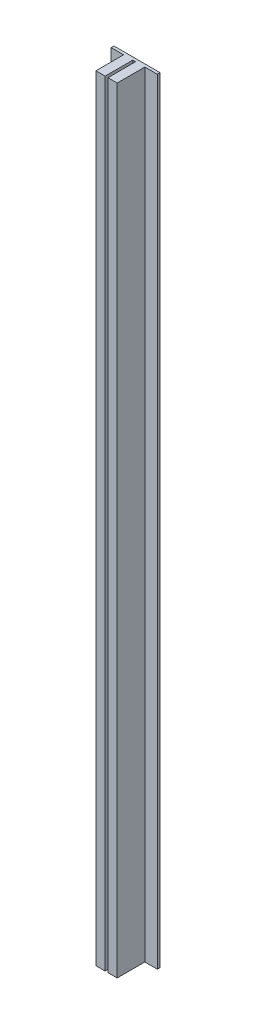
ISO-10303-21;
HEADER;
FILE_DESCRIPTION(('STEP AP214'),'2;1');
FILE_NAME('part.step','',(''),(''),'','','');
FILE_SCHEMA(('AUTOMOTIVE_DESIGN { 1 0 10303 214 1 1 1 1 }'));
ENDSEC;
DATA;
#1=APPLICATION_CONTEXT('core data for automotive mechanical design processes');
#2=APPLICATION_PROTOCOL_DEFINITION('international standard','automotive_design',2000,#1);
#3=PRODUCT_CONTEXT('',#1,'mechanical');
#4=PRODUCT('Part','Part','',(#3));
#5=PRODUCT_RELATED_PRODUCT_CATEGORY('part','',(#4));
#6=PRODUCT_DEFINITION_FORMATION('','',#4);
#7=PRODUCT_DEFINITION_CONTEXT('part definition',#1,'design');
#8=PRODUCT_DEFINITION('design','',#6,#7);
#9=PRODUCT_DEFINITION_SHAPE('','',#8);
#10=(LENGTH_UNIT() NAMED_UNIT(*) SI_UNIT(.MILLI.,.METRE.));
#11=(NAMED_UNIT(*) PLANE_ANGLE_UNIT() SI_UNIT($,.RADIAN.));
#12=(NAMED_UNIT(*) SI_UNIT($,.STERADIAN.) SOLID_ANGLE_UNIT());
#13=UNCERTAINTY_MEASURE_WITH_UNIT(LENGTH_MEASURE(1.E-05),#10,'distance_accuracy_value','');
#14=(GEOMETRIC_REPRESENTATION_CONTEXT(3) GLOBAL_UNCERTAINTY_ASSIGNED_CONTEXT((#13)) GLOBAL_UNIT_ASSIGNED_CONTEXT((#10,
#11,#12)) REPRESENTATION_CONTEXT('',''));
#15=CARTESIAN_POINT('',(0.,0.,0.));
#16=DIRECTION('',(0.,0.,1.));
#17=DIRECTION('',(1.,0.,0.));
#18=AXIS2_PLACEMENT_3D('',#15,#16,#17);
#19=CARTESIAN_POINT('',(0.,0.,33.));
#20=DIRECTION('',(0.,0.,1.));
#21=DIRECTION('',(1.,0.,0.));
#22=AXIS2_PLACEMENT_3D('',#19,#20,#21);
#23=PLANE('',#22);
#24=DIRECTION('',(0.,-1.,0.));
#25=VECTOR('',#24,1.);
#26=CARTESIAN_POINT('',(23.5,0.,33.));
#27=LINE('',#26,#25);
#28=CARTESIAN_POINT('',(23.5,0.,33.));
#29=VERTEX_POINT('',#28);
#30=CARTESIAN_POINT('',(23.5000000000001,-840.,33.));
#31=VERTEX_POINT('',#30);
#32=EDGE_CURVE('E126',#29,#31,#27,.T.);
#33=ORIENTED_EDGE('',*,*,#32,.F.);
#34=DIRECTION('',(-1.,0.,0.));
#35=VECTOR('',#34,1.);
#36=CARTESIAN_POINT('',(13.5,0.,33.));
#37=LINE('',#36,#35);
#38=CARTESIAN_POINT('',(13.5,0.,33.));
#39=VERTEX_POINT('',#38);
#40=EDGE_CURVE('E152',#29,#39,#37,.T.);
#41=ORIENTED_EDGE('',*,*,#40,.T.);
#42=DIRECTION('',(0.,-1.,0.));
#43=VECTOR('',#42,1.);
#44=CARTESIAN_POINT('',(13.5,0.,33.));
#45=LINE('',#44,#43);
#46=CARTESIAN_POINT('',(13.5000000000001,-840.,33.));
#47=VERTEX_POINT('',#46);
#48=EDGE_CURVE('E147',#39,#47,#45,.T.);
#49=ORIENTED_EDGE('',*,*,#48,.T.);
#50=DIRECTION('',(1.,0.,0.));
#51=VECTOR('',#50,1.);
#52=CARTESIAN_POINT('',(13.5000000000001,-840.,33.));
#53=LINE('',#52,#51);
#54=EDGE_CURVE('E141',#47,#31,#53,.T.);
#55=ORIENTED_EDGE('',*,*,#54,.T.);
#56=EDGE_LOOP('',(#33,#41,#49,#55));
#57=FACE_BOUND('',#56,.T.);
#58=ADVANCED_FACE('F37',(#57),#23,.T.);
#59=CARTESIAN_POINT('',(0.,0.,3.));
#60=DIRECTION('',(0.,0.,1.));
#61=DIRECTION('',(1.,0.,0.));
#62=AXIS2_PLACEMENT_3D('',#59,#60,#61);
#63=PLANE('',#62);
#64=DIRECTION('',(0.,-1.,0.));
#65=VECTOR('',#64,1.);
#66=CARTESIAN_POINT('',(13.5,0.,3.));
#67=LINE('',#66,#65);
#68=CARTESIAN_POINT('',(13.5000000000001,0.,3.));
#69=VERTEX_POINT('',#68);
#70=CARTESIAN_POINT('',(13.5000000000001,-840.,3.));
#71=VERTEX_POINT('',#70);
#72=EDGE_CURVE('E60',#69,#71,#67,.T.);
#73=ORIENTED_EDGE('',*,*,#72,.F.);
#74=DIRECTION('',(-1.,0.,0.));
#75=VECTOR('',#74,1.);
#76=CARTESIAN_POINT('',(0.,0.,3.));
#77=LINE('',#76,#75);
#78=CARTESIAN_POINT('',(0.,0.,3.));
#79=VERTEX_POINT('',#78);
#80=EDGE_CURVE('E185',#69,#79,#77,.T.);
#81=ORIENTED_EDGE('',*,*,#80,.T.);
#82=DIRECTION('',(0.,-1.,0.));
#83=VECTOR('',#82,1.);
#84=CARTESIAN_POINT('',(0.,0.,3.));
#85=LINE('',#84,#83);
#86=CARTESIAN_POINT('',(1.02870331128378E-13,-840.,3.));
#87=VERTEX_POINT('',#86);
#88=EDGE_CURVE('E176',#79,#87,#85,.T.);
#89=ORIENTED_EDGE('',*,*,#88,.T.);
#90=DIRECTION('',(1.,0.,0.));
#91=VECTOR('',#90,1.);
#92=CARTESIAN_POINT('',(1.02870331128378E-13,-840.,3.));
#93=LINE('',#92,#91);
#94=EDGE_CURVE('E181',#87,#71,#93,.T.);
#95=ORIENTED_EDGE('',*,*,#94,.T.);
#96=EDGE_LOOP('',(#73,#81,#89,#95));
#97=FACE_BOUND('',#96,.T.);
#98=ADVANCED_FACE('F219',(#97),#63,.T.);
#99=CARTESIAN_POINT('',(0.,0.,3.));
#100=DIRECTION('',(1.,0.,0.));
#101=DIRECTION('',(0.,1.,0.));
#102=AXIS2_PLACEMENT_3D('',#99,#100,#101);
#103=PLANE('',#102);
#104=DIRECTION('',(0.,-1.,0.));
#105=VECTOR('',#104,1.);
#106=CARTESIAN_POINT('',(0.,0.,0.));
#107=LINE('',#106,#105);
#108=CARTESIAN_POINT('',(0.,0.,0.));
#109=VERTEX_POINT('',#108);
#110=CARTESIAN_POINT('',(1.02870331128378E-13,-840.,0.));
#111=VERTEX_POINT('',#110);
#112=EDGE_CURVE('E175',#109,#111,#107,.T.);
#113=ORIENTED_EDGE('',*,*,#112,.T.);
#114=DIRECTION('',(0.,0.,-1.));
#115=VECTOR('',#114,1.);
#116=CARTESIAN_POINT('',(1.02870331128378E-13,-840.,3.));
#117=LINE('',#116,#115);
#118=EDGE_CURVE('E11',#87,#111,#117,.T.);
#119=ORIENTED_EDGE('',*,*,#118,.F.);
#120=ORIENTED_EDGE('',*,*,#88,.F.);
#121=DIRECTION('',(0.,0.,-1.));
#122=VECTOR('',#121,1.);
#123=CARTESIAN_POINT('',(0.,0.,3.));
#124=LINE('',#123,#122);
#125=EDGE_CURVE('E188',#79,#109,#124,.T.);
#126=ORIENTED_EDGE('',*,*,#125,.T.);
#127=EDGE_LOOP('',(#113,#119,#120,#126));
#128=FACE_BOUND('',#127,.T.);
#129=ADVANCED_FACE('F39',(#128),#103,.F.);
#130=CARTESIAN_POINT('',(1.02870331128378E-13,-840.,3.));
#131=DIRECTION('',(0.,1.,0.));
#132=DIRECTION('',(0.,0.,1.));
#133=AXIS2_PLACEMENT_3D('',#130,#131,#132);
#134=PLANE('',#133);
#135=DIRECTION('',(-1.,0.,0.));
#136=VECTOR('',#135,1.);
#137=CARTESIAN_POINT('',(23.5000000000001,-840.,3.));
#138=LINE('',#137,#136);
#139=CARTESIAN_POINT('',(26.5000000000001,-840.,3.));
#140=VERTEX_POINT('',#139);
#141=CARTESIAN_POINT('',(23.5000000000001,-840.,3.));
#142=VERTEX_POINT('',#141);
#143=EDGE_CURVE('E144',#140,#142,#138,.T.);
#144=ORIENTED_EDGE('',*,*,#143,.T.);
#145=DIRECTION('',(0.,0.,1.));
#146=VECTOR('',#145,1.);
#147=CARTESIAN_POINT('',(23.5000000000001,-840.,-837.005357125774));
#148=LINE('',#147,#146);
#149=EDGE_CURVE('E129',#142,#31,#148,.T.);
#150=ORIENTED_EDGE('',*,*,#149,.T.);
#151=ORIENTED_EDGE('',*,*,#54,.F.);
#152=DIRECTION('',(0.,0.,-1.));
#153=VECTOR('',#152,1.);
#154=CARTESIAN_POINT('',(13.5000000000001,-840.,33.));
#155=LINE('',#154,#153);
#156=EDGE_CURVE('E173',#47,#71,#155,.T.);
#157=ORIENTED_EDGE('',*,*,#156,.T.);
#158=ORIENTED_EDGE('',*,*,#94,.F.);
#159=ORIENTED_EDGE('',*,*,#118,.T.);
#160=DIRECTION('',(1.,0.,0.));
#161=VECTOR('',#160,1.);
#162=CARTESIAN_POINT('',(1.02870331128378E-13,-840.,0.));
#163=LINE('',#162,#161);
#164=CARTESIAN_POINT('',(50.0000000000001,-840.,0.));
#165=VERTEX_POINT('',#164);
#166=EDGE_CURVE('E191',#111,#165,#163,.T.);
#167=ORIENTED_EDGE('',*,*,#166,.T.);
#168=DIRECTION('',(0.,0.,-1.));
#169=VECTOR('',#168,1.);
#170=CARTESIAN_POINT('',(50.0000000000001,-840.,3.));
#171=LINE('',#170,#169);
#172=CARTESIAN_POINT('',(50.0000000000001,-840.,3.));
#173=VERTEX_POINT('',#172);
#174=EDGE_CURVE('E45',#173,#165,#171,.T.);
#175=ORIENTED_EDGE('',*,*,#174,.F.);
#176=CARTESIAN_POINT('',(36.5000000000001,-840.,3.));
#177=VERTEX_POINT('',#176);
#178=EDGE_CURVE('E179',#177,#173,#93,.T.);
#179=ORIENTED_EDGE('',*,*,#178,.F.);
#180=DIRECTION('',(0.,0.,-1.));
#181=VECTOR('',#180,1.);
#182=CARTESIAN_POINT('',(36.5000000000001,-840.,33.));
#183=LINE('',#182,#181);
#184=CARTESIAN_POINT('',(36.5000000000001,-840.,33.));
#185=VERTEX_POINT('',#184);
#186=EDGE_CURVE('E170',#185,#177,#183,.T.);
#187=ORIENTED_EDGE('',*,*,#186,.F.);
#188=CARTESIAN_POINT('',(26.5000000000001,-840.,33.));
#189=VERTEX_POINT('',#188);
#190=EDGE_CURVE('E150',#189,#185,#53,.T.);
#191=ORIENTED_EDGE('',*,*,#190,.F.);
#192=DIRECTION('',(0.,0.,1.));
#193=VECTOR('',#192,1.);
#194=CARTESIAN_POINT('',(26.5000000000001,-840.,-837.005357125774));
#195=LINE('',#194,#193);
#196=EDGE_CURVE('E52',#140,#189,#195,.T.);
#197=ORIENTED_EDGE('',*,*,#196,.F.);
#198=EDGE_LOOP('',(#144,#150,#151,#157,#158,#159,#167,#175,#179,#187,#191,#197));
#199=FACE_BOUND('',#198,.T.);
#200=ADVANCED_FACE('F139',(#199),#134,.F.);
#201=CARTESIAN_POINT('',(50.,0.,3.));
#202=DIRECTION('',(-1.,0.,0.));
#203=DIRECTION('',(0.,-1.,0.));
#204=AXIS2_PLACEMENT_3D('',#201,#202,#203);
#205=PLANE('',#204);
#206=DIRECTION('',(0.,1.,0.));
#207=VECTOR('',#206,1.);
#208=CARTESIAN_POINT('',(50.,0.,0.));
#209=LINE('',#208,#207);
#210=CARTESIAN_POINT('',(50.,0.,0.));
#211=VERTEX_POINT('',#210);
#212=EDGE_CURVE('E193',#165,#211,#209,.T.);
#213=ORIENTED_EDGE('',*,*,#212,.T.);
#214=DIRECTION('',(0.,0.,-1.));
#215=VECTOR('',#214,1.);
#216=CARTESIAN_POINT('',(50.,0.,3.));
#217=LINE('',#216,#215);
#218=CARTESIAN_POINT('',(50.,0.,3.));
#219=VERTEX_POINT('',#218);
#220=EDGE_CURVE('E198',#219,#211,#217,.T.);
#221=ORIENTED_EDGE('',*,*,#220,.F.);
#222=DIRECTION('',(0.,1.,0.));
#223=VECTOR('',#222,1.);
#224=CARTESIAN_POINT('',(50.,0.,3.));
#225=LINE('',#224,#223);
#226=EDGE_CURVE('E183',#173,#219,#225,.T.);
#227=ORIENTED_EDGE('',*,*,#226,.F.);
#228=ORIENTED_EDGE('',*,*,#174,.T.);
#229=EDGE_LOOP('',(#213,#221,#227,#228));
#230=FACE_BOUND('',#229,.T.);
#231=ADVANCED_FACE('F205',(#230),#205,.F.);
#232=CARTESIAN_POINT('',(0.,0.,3.));
#233=DIRECTION('',(0.,-1.,0.));
#234=DIRECTION('',(0.,0.,-1.));
#235=AXIS2_PLACEMENT_3D('',#232,#233,#234);
#236=PLANE('',#235);
#237=ORIENTED_EDGE('',*,*,#40,.F.);
#238=DIRECTION('',(0.,0.,1.));
#239=VECTOR('',#238,1.);
#240=CARTESIAN_POINT('',(23.5,0.,-837.005357125774));
#241=LINE('',#240,#239);
#242=CARTESIAN_POINT('',(23.5,0.,3.));
#243=VERTEX_POINT('',#242);
#244=EDGE_CURVE('E132',#243,#29,#241,.T.);
#245=ORIENTED_EDGE('',*,*,#244,.F.);
#246=DIRECTION('',(1.,0.,0.));
#247=VECTOR('',#246,1.);
#248=CARTESIAN_POINT('',(23.5,0.,3.));
#249=LINE('',#248,#247);
#250=CARTESIAN_POINT('',(26.5,0.,3.));
#251=VERTEX_POINT('',#250);
#252=EDGE_CURVE('E259',#243,#251,#249,.T.);
#253=ORIENTED_EDGE('',*,*,#252,.T.);
#254=DIRECTION('',(0.,0.,1.));
#255=VECTOR('',#254,1.);
#256=CARTESIAN_POINT('',(26.5,0.,-837.005357125774));
#257=LINE('',#256,#255);
#258=CARTESIAN_POINT('',(26.5,0.,33.));
#259=VERTEX_POINT('',#258);
#260=EDGE_CURVE('E257',#251,#259,#257,.T.);
#261=ORIENTED_EDGE('',*,*,#260,.T.);
#262=CARTESIAN_POINT('',(36.5,0.,33.));
#263=VERTEX_POINT('',#262);
#264=EDGE_CURVE('E157',#263,#259,#37,.T.);
#265=ORIENTED_EDGE('',*,*,#264,.F.);
#266=DIRECTION('',(0.,0.,-1.));
#267=VECTOR('',#266,1.);
#268=CARTESIAN_POINT('',(36.5,0.,33.));
#269=LINE('',#268,#267);
#270=CARTESIAN_POINT('',(36.5,0.,3.));
#271=VERTEX_POINT('',#270);
#272=EDGE_CURVE('E167',#263,#271,#269,.T.);
#273=ORIENTED_EDGE('',*,*,#272,.T.);
#274=EDGE_CURVE('E186',#219,#271,#77,.T.);
#275=ORIENTED_EDGE('',*,*,#274,.F.);
#276=ORIENTED_EDGE('',*,*,#220,.T.);
#277=DIRECTION('',(-1.,0.,0.));
#278=VECTOR('',#277,1.);
#279=CARTESIAN_POINT('',(0.,0.,0.));
#280=LINE('',#279,#278);
#281=EDGE_CURVE('E180',#211,#109,#280,.T.);
#282=ORIENTED_EDGE('',*,*,#281,.T.);
#283=ORIENTED_EDGE('',*,*,#125,.F.);
#284=ORIENTED_EDGE('',*,*,#80,.F.);
#285=DIRECTION('',(0.,0.,-1.));
#286=VECTOR('',#285,1.);
#287=CARTESIAN_POINT('',(13.5,0.,33.));
#288=LINE('',#287,#286);
#289=EDGE_CURVE('E160',#39,#69,#288,.T.);
#290=ORIENTED_EDGE('',*,*,#289,.F.);
#291=EDGE_LOOP('',(#237,#245,#253,#261,#265,#273,#275,#276,#282,#283,#284,#290));
#292=FACE_BOUND('',#291,.T.);
#293=ADVANCED_FACE('F214',(#292),#236,.F.);
#294=DIRECTION('',(0.,1.,0.));
#295=VECTOR('',#294,1.);
#296=CARTESIAN_POINT('',(36.5,0.,3.));
#297=LINE('',#296,#295);
#298=EDGE_CURVE('E162',#177,#271,#297,.T.);
#299=ORIENTED_EDGE('',*,*,#298,.F.);
#300=ORIENTED_EDGE('',*,*,#178,.T.);
#301=ORIENTED_EDGE('',*,*,#226,.T.);
#302=ORIENTED_EDGE('',*,*,#274,.T.);
#303=EDGE_LOOP('',(#299,#300,#301,#302));
#304=FACE_BOUND('',#303,.T.);
#305=ADVANCED_FACE('F233',(#304),#63,.T.);
#306=CARTESIAN_POINT('',(0.,0.,0.));
#307=DIRECTION('',(0.,0.,1.));
#308=DIRECTION('',(1.,0.,0.));
#309=AXIS2_PLACEMENT_3D('',#306,#307,#308);
#310=PLANE('',#309);
#311=ORIENTED_EDGE('',*,*,#112,.F.);
#312=ORIENTED_EDGE('',*,*,#281,.F.);
#313=ORIENTED_EDGE('',*,*,#212,.F.);
#314=ORIENTED_EDGE('',*,*,#166,.F.);
#315=EDGE_LOOP('',(#311,#312,#313,#314));
#316=FACE_BOUND('',#315,.T.);
#317=ADVANCED_FACE('F211',(#316),#310,.F.);
#318=CARTESIAN_POINT('',(13.5,0.,33.));
#319=DIRECTION('',(1.,0.,0.));
#320=DIRECTION('',(0.,1.,0.));
#321=AXIS2_PLACEMENT_3D('',#318,#319,#320);
#322=PLANE('',#321);
#323=ORIENTED_EDGE('',*,*,#72,.T.);
#324=ORIENTED_EDGE('',*,*,#156,.F.);
#325=ORIENTED_EDGE('',*,*,#48,.F.);
#326=ORIENTED_EDGE('',*,*,#289,.T.);
#327=EDGE_LOOP('',(#323,#324,#325,#326));
#328=FACE_BOUND('',#327,.T.);
#329=ADVANCED_FACE('F222',(#328),#322,.F.);
#330=CARTESIAN_POINT('',(36.5,0.,33.));
#331=DIRECTION('',(-1.,0.,0.));
#332=DIRECTION('',(0.,-1.,0.));
#333=AXIS2_PLACEMENT_3D('',#330,#331,#332);
#334=PLANE('',#333);
#335=ORIENTED_EDGE('',*,*,#298,.T.);
#336=ORIENTED_EDGE('',*,*,#272,.F.);
#337=DIRECTION('',(0.,1.,0.));
#338=VECTOR('',#337,1.);
#339=CARTESIAN_POINT('',(36.5,0.,33.));
#340=LINE('',#339,#338);
#341=EDGE_CURVE('E149',#185,#263,#340,.T.);
#342=ORIENTED_EDGE('',*,*,#341,.F.);
#343=ORIENTED_EDGE('',*,*,#186,.T.);
#344=EDGE_LOOP('',(#335,#336,#342,#343));
#345=FACE_BOUND('',#344,.T.);
#346=ADVANCED_FACE('F224',(#345),#334,.F.);
#347=DIRECTION('',(0.,1.,0.));
#348=VECTOR('',#347,1.);
#349=CARTESIAN_POINT('',(26.5,0.,33.));
#350=LINE('',#349,#348);
#351=EDGE_CURVE('E136',#189,#259,#350,.T.);
#352=ORIENTED_EDGE('',*,*,#351,.F.);
#353=ORIENTED_EDGE('',*,*,#190,.T.);
#354=ORIENTED_EDGE('',*,*,#341,.T.);
#355=ORIENTED_EDGE('',*,*,#264,.T.);
#356=EDGE_LOOP('',(#352,#353,#354,#355));
#357=FACE_BOUND('',#356,.T.);
#358=ADVANCED_FACE('F230',(#357),#23,.T.);
#359=CARTESIAN_POINT('',(23.5,0.,-837.005357125774));
#360=DIRECTION('',(-1.,0.,0.));
#361=DIRECTION('',(0.,-1.,0.));
#362=AXIS2_PLACEMENT_3D('',#359,#360,#361);
#363=PLANE('',#362);
#364=DIRECTION('',(0.,1.,0.));
#365=VECTOR('',#364,1.);
#366=CARTESIAN_POINT('',(23.5,0.,3.));
#367=LINE('',#366,#365);
#368=EDGE_CURVE('E264',#142,#243,#367,.T.);
#369=ORIENTED_EDGE('',*,*,#368,.T.);
#370=ORIENTED_EDGE('',*,*,#244,.T.);
#371=ORIENTED_EDGE('',*,*,#32,.T.);
#372=ORIENTED_EDGE('',*,*,#149,.F.);
#373=EDGE_LOOP('',(#369,#370,#371,#372));
#374=FACE_BOUND('',#373,.T.);
#375=ADVANCED_FACE('F128',(#374),#363,.F.);
#376=CARTESIAN_POINT('',(26.5,0.,-837.005357125774));
#377=DIRECTION('',(1.,0.,0.));
#378=DIRECTION('',(0.,1.,0.));
#379=AXIS2_PLACEMENT_3D('',#376,#377,#378);
#380=PLANE('',#379);
#381=DIRECTION('',(0.,-1.,0.));
#382=VECTOR('',#381,1.);
#383=CARTESIAN_POINT('',(26.5,0.,3.));
#384=LINE('',#383,#382);
#385=EDGE_CURVE('E261',#251,#140,#384,.T.);
#386=ORIENTED_EDGE('',*,*,#385,.T.);
#387=ORIENTED_EDGE('',*,*,#196,.T.);
#388=ORIENTED_EDGE('',*,*,#351,.T.);
#389=ORIENTED_EDGE('',*,*,#260,.F.);
#390=EDGE_LOOP('',(#386,#387,#388,#389));
#391=FACE_BOUND('',#390,.T.);
#392=ADVANCED_FACE('F247',(#391),#380,.F.);
#393=CARTESIAN_POINT('',(0.,0.,3.));
#394=DIRECTION('',(0.,0.,1.));
#395=DIRECTION('',(1.,0.,0.));
#396=AXIS2_PLACEMENT_3D('',#393,#394,#395);
#397=PLANE('',#396);
#398=ORIENTED_EDGE('',*,*,#368,.F.);
#399=ORIENTED_EDGE('',*,*,#143,.F.);
#400=ORIENTED_EDGE('',*,*,#385,.F.);
#401=ORIENTED_EDGE('',*,*,#252,.F.);
#402=EDGE_LOOP('',(#398,#399,#400,#401));
#403=FACE_BOUND('',#402,.T.);
#404=ADVANCED_FACE('F269',(#403),#397,.T.);
#405=CLOSED_SHELL('',(#58,#98,#129,#200,#231,#293,#305,#317,#329,#346,#358,#375,#392,#404));
#406=MANIFOLD_SOLID_BREP('B2',#405);
#407=ADVANCED_BREP_SHAPE_REPRESENTATION('',(#18,#406),#14);
#408=SHAPE_DEFINITION_REPRESENTATION(#9,#407);
ENDSEC;
END-ISO-10303-21;
